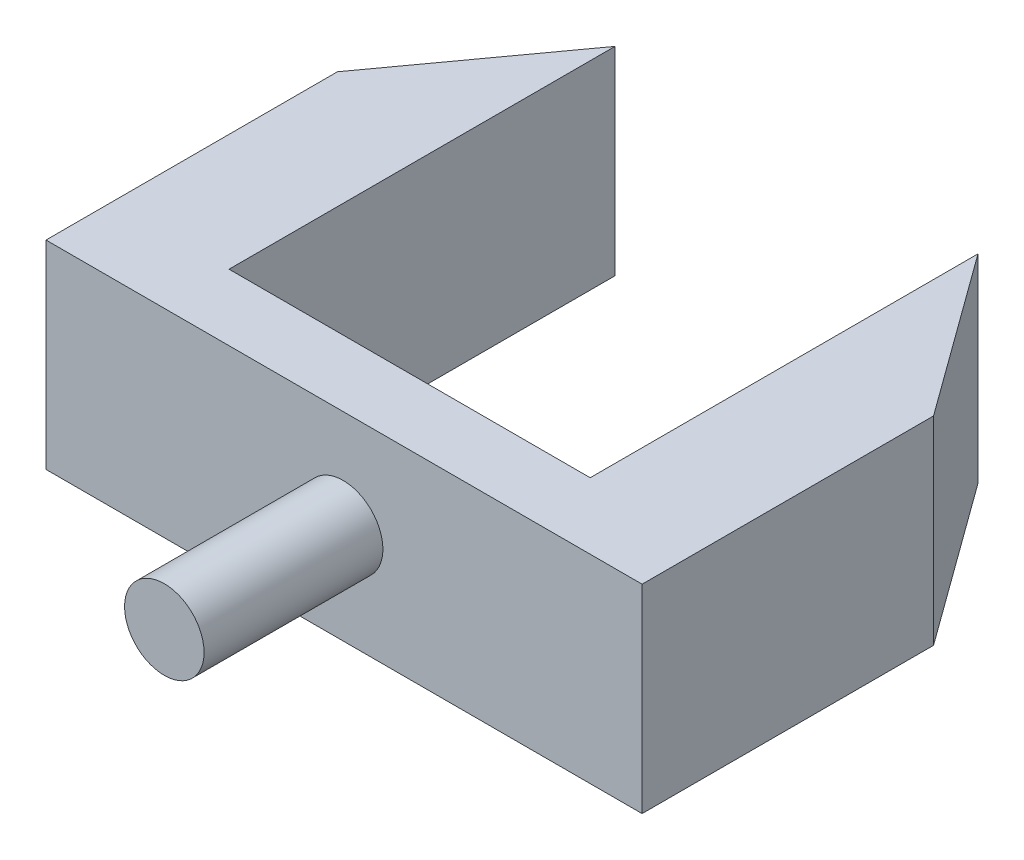
ISO-10303-21;
HEADER;
FILE_DESCRIPTION(('STEP AP214'),'2;1');
FILE_NAME('part.step','',(''),(''),'','','');
FILE_SCHEMA(('AUTOMOTIVE_DESIGN { 1 0 10303 214 1 1 1 1 }'));
ENDSEC;
DATA;
#1=APPLICATION_CONTEXT('core data for automotive mechanical design processes');
#2=APPLICATION_PROTOCOL_DEFINITION('international standard','automotive_design',2000,#1);
#3=PRODUCT_CONTEXT('',#1,'mechanical');
#4=PRODUCT('Part','Part','',(#3));
#5=PRODUCT_RELATED_PRODUCT_CATEGORY('part','',(#4));
#6=PRODUCT_DEFINITION_FORMATION('','',#4);
#7=PRODUCT_DEFINITION_CONTEXT('part definition',#1,'design');
#8=PRODUCT_DEFINITION('design','',#6,#7);
#9=PRODUCT_DEFINITION_SHAPE('','',#8);
#10=(LENGTH_UNIT() NAMED_UNIT(*) SI_UNIT(.MILLI.,.METRE.));
#11=(NAMED_UNIT(*) PLANE_ANGLE_UNIT() SI_UNIT($,.RADIAN.));
#12=(NAMED_UNIT(*) SI_UNIT($,.STERADIAN.) SOLID_ANGLE_UNIT());
#13=UNCERTAINTY_MEASURE_WITH_UNIT(LENGTH_MEASURE(1.E-05),#10,'distance_accuracy_value','');
#14=(GEOMETRIC_REPRESENTATION_CONTEXT(3) GLOBAL_UNCERTAINTY_ASSIGNED_CONTEXT((#13)) GLOBAL_UNIT_ASSIGNED_CONTEXT((#10,
#11,#12)) REPRESENTATION_CONTEXT('',''));
#15=CARTESIAN_POINT('',(0.,0.,0.));
#16=DIRECTION('',(0.,0.,1.));
#17=DIRECTION('',(1.,0.,0.));
#18=AXIS2_PLACEMENT_3D('',#15,#16,#17);
#19=CARTESIAN_POINT('',(-22.3623853211009,15.,0.));
#20=DIRECTION('',(1.,0.,0.));
#21=DIRECTION('',(0.,0.,-1.));
#22=AXIS2_PLACEMENT_3D('',#19,#20,#21);
#23=PLANE('',#22);
#24=DIRECTION('',(0.,0.,1.));
#25=VECTOR('',#24,1.);
#26=CARTESIAN_POINT('',(-22.3623853211009,0.,0.));
#27=LINE('',#26,#25);
#28=CARTESIAN_POINT('',(-22.3623853211009,0.,-22.));
#29=VERTEX_POINT('',#28);
#30=CARTESIAN_POINT('',(-22.3623853211009,0.,0.));
#31=VERTEX_POINT('',#30);
#32=EDGE_CURVE('E133',#29,#31,#27,.T.);
#33=ORIENTED_EDGE('',*,*,#32,.T.);
#34=DIRECTION('',(0.,-1.,0.));
#35=VECTOR('',#34,1.);
#36=CARTESIAN_POINT('',(-22.3623853211009,15.,0.));
#37=LINE('',#36,#35);
#38=CARTESIAN_POINT('',(-22.3623853211009,15.,0.));
#39=VERTEX_POINT('',#38);
#40=EDGE_CURVE('E44',#39,#31,#37,.T.);
#41=ORIENTED_EDGE('',*,*,#40,.F.);
#42=DIRECTION('',(0.,0.,1.));
#43=VECTOR('',#42,1.);
#44=CARTESIAN_POINT('',(-22.3623853211009,15.,0.));
#45=LINE('',#44,#43);
#46=CARTESIAN_POINT('',(-22.3623853211009,15.,-22.));
#47=VERTEX_POINT('',#46);
#48=EDGE_CURVE('E148',#47,#39,#45,.T.);
#49=ORIENTED_EDGE('',*,*,#48,.F.);
#50=DIRECTION('',(0.,-1.,0.));
#51=VECTOR('',#50,1.);
#52=CARTESIAN_POINT('',(-22.3623853211009,15.,-22.));
#53=LINE('',#52,#51);
#54=EDGE_CURVE('E129',#47,#29,#53,.T.);
#55=ORIENTED_EDGE('',*,*,#54,.T.);
#56=EDGE_LOOP('',(#33,#41,#49,#55));
#57=FACE_BOUND('',#56,.T.);
#58=ADVANCED_FACE('F36',(#57),#23,.F.);
#59=CARTESIAN_POINT('',(-22.3623853211009,15.,0.));
#60=DIRECTION('',(0.,0.,-1.));
#61=DIRECTION('',(-1.,0.,0.));
#62=AXIS2_PLACEMENT_3D('',#59,#60,#61);
#63=PLANE('',#62);
#64=CARTESIAN_POINT('',(0.068807339449542,7.5,0.));
#65=DIRECTION('',(0.,0.,-1.));
#66=DIRECTION('',(-1.,0.,0.));
#67=AXIS2_PLACEMENT_3D('',#64,#65,#66);
#68=CIRCLE('',#67,3.);
#69=CARTESIAN_POINT('',(-2.93119266055046,7.5,0.));
#70=VERTEX_POINT('',#69);
#71=EDGE_CURVE('E11',#70,#70,#68,.F.);
#72=ORIENTED_EDGE('',*,*,#71,.F.);
#73=EDGE_LOOP('',(#72));
#74=FACE_BOUND('',#73,.T.);
#75=DIRECTION('',(1.,0.,0.));
#76=VECTOR('',#75,1.);
#77=CARTESIAN_POINT('',(-22.3623853211009,0.,0.));
#78=LINE('',#77,#76);
#79=CARTESIAN_POINT('',(22.6376146788991,0.,0.));
#80=VERTEX_POINT('',#79);
#81=EDGE_CURVE('E136',#31,#80,#78,.T.);
#82=ORIENTED_EDGE('',*,*,#81,.T.);
#83=DIRECTION('',(0.,-1.,0.));
#84=VECTOR('',#83,1.);
#85=CARTESIAN_POINT('',(22.6376146788991,15.,0.));
#86=LINE('',#85,#84);
#87=CARTESIAN_POINT('',(22.6376146788991,15.,0.));
#88=VERTEX_POINT('',#87);
#89=EDGE_CURVE('E158',#88,#80,#86,.T.);
#90=ORIENTED_EDGE('',*,*,#89,.F.);
#91=DIRECTION('',(1.,0.,0.));
#92=VECTOR('',#91,1.);
#93=CARTESIAN_POINT('',(-22.3623853211009,15.,0.));
#94=LINE('',#93,#92);
#95=EDGE_CURVE('E96',#39,#88,#94,.T.);
#96=ORIENTED_EDGE('',*,*,#95,.F.);
#97=ORIENTED_EDGE('',*,*,#40,.T.);
#98=EDGE_LOOP('',(#82,#90,#96,#97));
#99=FACE_BOUND('',#98,.T.);
#100=ADVANCED_FACE('F161',(#74,#99),#63,.F.);
#101=CARTESIAN_POINT('',(22.6376146788991,15.,0.));
#102=DIRECTION('',(-1.,0.,0.));
#103=DIRECTION('',(0.,0.,1.));
#104=AXIS2_PLACEMENT_3D('',#101,#102,#103);
#105=PLANE('',#104);
#106=DIRECTION('',(0.,0.,-1.));
#107=VECTOR('',#106,1.);
#108=CARTESIAN_POINT('',(22.6376146788991,0.,0.));
#109=LINE('',#108,#107);
#110=CARTESIAN_POINT('',(22.6376146788991,0.,-22.));
#111=VERTEX_POINT('',#110);
#112=EDGE_CURVE('E139',#80,#111,#109,.T.);
#113=ORIENTED_EDGE('',*,*,#112,.T.);
#114=DIRECTION('',(0.,-1.,0.));
#115=VECTOR('',#114,1.);
#116=CARTESIAN_POINT('',(22.6376146788991,15.,-22.));
#117=LINE('',#116,#115);
#118=CARTESIAN_POINT('',(22.6376146788991,15.,-22.));
#119=VERTEX_POINT('',#118);
#120=EDGE_CURVE('E155',#119,#111,#117,.T.);
#121=ORIENTED_EDGE('',*,*,#120,.F.);
#122=DIRECTION('',(0.,0.,-1.));
#123=VECTOR('',#122,1.);
#124=CARTESIAN_POINT('',(22.6376146788991,15.,0.));
#125=LINE('',#124,#123);
#126=EDGE_CURVE('E179',#88,#119,#125,.T.);
#127=ORIENTED_EDGE('',*,*,#126,.F.);
#128=ORIENTED_EDGE('',*,*,#89,.T.);
#129=EDGE_LOOP('',(#113,#121,#127,#128));
#130=FACE_BOUND('',#129,.T.);
#131=ADVANCED_FACE('F172',(#130),#105,.F.);
#132=CARTESIAN_POINT('',(22.6376146788991,15.,-22.));
#133=DIRECTION('',(-0.809016994374947,0.,0.587785252292474));
#134=DIRECTION('',(0.587785252292474,0.,0.809016994374947));
#135=AXIS2_PLACEMENT_3D('',#132,#133,#134);
#136=PLANE('',#135);
#137=DIRECTION('',(-0.587785252292474,0.,-0.809016994374947));
#138=VECTOR('',#137,1.);
#139=CARTESIAN_POINT('',(22.6376146788991,0.,-22.));
#140=LINE('',#139,#138);
#141=CARTESIAN_POINT('',(13.7189171020698,0.,-34.2755340988979));
#142=VERTEX_POINT('',#141);
#143=EDGE_CURVE('E141',#111,#142,#140,.T.);
#144=ORIENTED_EDGE('',*,*,#143,.T.);
#145=DIRECTION('',(0.,-1.,0.));
#146=VECTOR('',#145,1.);
#147=CARTESIAN_POINT('',(13.7189171020698,15.,-34.2755340988979));
#148=LINE('',#147,#146);
#149=CARTESIAN_POINT('',(13.7189171020698,15.,-34.2755340988979));
#150=VERTEX_POINT('',#149);
#151=EDGE_CURVE('E152',#150,#142,#148,.T.);
#152=ORIENTED_EDGE('',*,*,#151,.F.);
#153=DIRECTION('',(-0.587785252292474,0.,-0.809016994374947));
#154=VECTOR('',#153,1.);
#155=CARTESIAN_POINT('',(22.6376146788991,15.,-22.));
#156=LINE('',#155,#154);
#157=EDGE_CURVE('E178',#119,#150,#156,.T.);
#158=ORIENTED_EDGE('',*,*,#157,.F.);
#159=ORIENTED_EDGE('',*,*,#120,.T.);
#160=EDGE_LOOP('',(#144,#152,#158,#159));
#161=FACE_BOUND('',#160,.T.);
#162=ADVANCED_FACE('F176',(#161),#136,.F.);
#163=CARTESIAN_POINT('',(13.7189171020698,15.,-5.));
#164=DIRECTION('',(1.,0.,0.));
#165=DIRECTION('',(0.,0.,-1.));
#166=AXIS2_PLACEMENT_3D('',#163,#164,#165);
#167=PLANE('',#166);
#168=DIRECTION('',(0.,0.,1.));
#169=VECTOR('',#168,1.);
#170=CARTESIAN_POINT('',(13.7189171020698,0.,-5.));
#171=LINE('',#170,#169);
#172=CARTESIAN_POINT('',(13.7189171020698,0.,-5.));
#173=VERTEX_POINT('',#172);
#174=EDGE_CURVE('E143',#142,#173,#171,.T.);
#175=ORIENTED_EDGE('',*,*,#174,.T.);
#176=DIRECTION('',(0.,-1.,0.));
#177=VECTOR('',#176,1.);
#178=CARTESIAN_POINT('',(13.7189171020698,15.,-5.));
#179=LINE('',#178,#177);
#180=CARTESIAN_POINT('',(13.7189171020698,15.,-5.));
#181=VERTEX_POINT('',#180);
#182=EDGE_CURVE('E124',#181,#173,#179,.T.);
#183=ORIENTED_EDGE('',*,*,#182,.F.);
#184=DIRECTION('',(0.,0.,1.));
#185=VECTOR('',#184,1.);
#186=CARTESIAN_POINT('',(13.7189171020698,15.,-5.));
#187=LINE('',#186,#185);
#188=EDGE_CURVE('E115',#150,#181,#187,.T.);
#189=ORIENTED_EDGE('',*,*,#188,.F.);
#190=ORIENTED_EDGE('',*,*,#151,.T.);
#191=EDGE_LOOP('',(#175,#183,#189,#190));
#192=FACE_BOUND('',#191,.T.);
#193=ADVANCED_FACE('F205',(#192),#167,.F.);
#194=CARTESIAN_POINT('',(-13.5456065367138,15.,-5.));
#195=DIRECTION('',(0.,0.,1.));
#196=DIRECTION('',(1.,0.,0.));
#197=AXIS2_PLACEMENT_3D('',#194,#195,#196);
#198=PLANE('',#197);
#199=DIRECTION('',(-1.,0.,0.));
#200=VECTOR('',#199,1.);
#201=CARTESIAN_POINT('',(-13.5456065367138,0.,-5.));
#202=LINE('',#201,#200);
#203=CARTESIAN_POINT('',(-13.5456065367138,0.,-5.));
#204=VERTEX_POINT('',#203);
#205=EDGE_CURVE('E123',#173,#204,#202,.T.);
#206=ORIENTED_EDGE('',*,*,#205,.T.);
#207=DIRECTION('',(0.,-1.,0.));
#208=VECTOR('',#207,1.);
#209=CARTESIAN_POINT('',(-13.5456065367138,15.,-5.));
#210=LINE('',#209,#208);
#211=CARTESIAN_POINT('',(-13.5456065367138,15.,-5.));
#212=VERTEX_POINT('',#211);
#213=EDGE_CURVE('E120',#212,#204,#210,.T.);
#214=ORIENTED_EDGE('',*,*,#213,.F.);
#215=DIRECTION('',(-1.,0.,0.));
#216=VECTOR('',#215,1.);
#217=CARTESIAN_POINT('',(-13.5456065367138,15.,-5.));
#218=LINE('',#217,#216);
#219=EDGE_CURVE('E109',#181,#212,#218,.T.);
#220=ORIENTED_EDGE('',*,*,#219,.F.);
#221=ORIENTED_EDGE('',*,*,#182,.T.);
#222=EDGE_LOOP('',(#206,#214,#220,#221));
#223=FACE_BOUND('',#222,.T.);
#224=ADVANCED_FACE('F121',(#223),#198,.F.);
#225=CARTESIAN_POINT('',(-13.5456065367138,15.,-34.1352549156242));
#226=DIRECTION('',(-1.,0.,0.));
#227=DIRECTION('',(0.,0.,1.));
#228=AXIS2_PLACEMENT_3D('',#225,#226,#227);
#229=PLANE('',#228);
#230=DIRECTION('',(0.,0.,-1.));
#231=VECTOR('',#230,1.);
#232=CARTESIAN_POINT('',(-13.5456065367138,0.,-34.1352549156242));
#233=LINE('',#232,#231);
#234=CARTESIAN_POINT('',(-13.5456065367138,0.,-34.1352549156242));
#235=VERTEX_POINT('',#234);
#236=EDGE_CURVE('E81',#204,#235,#233,.T.);
#237=ORIENTED_EDGE('',*,*,#236,.T.);
#238=DIRECTION('',(0.,-1.,0.));
#239=VECTOR('',#238,1.);
#240=CARTESIAN_POINT('',(-13.5456065367138,15.,-34.1352549156242));
#241=LINE('',#240,#239);
#242=CARTESIAN_POINT('',(-13.5456065367138,15.,-34.1352549156242));
#243=VERTEX_POINT('',#242);
#244=EDGE_CURVE('E125',#243,#235,#241,.T.);
#245=ORIENTED_EDGE('',*,*,#244,.F.);
#246=DIRECTION('',(0.,0.,-1.));
#247=VECTOR('',#246,1.);
#248=CARTESIAN_POINT('',(-13.5456065367138,15.,-34.1352549156242));
#249=LINE('',#248,#247);
#250=EDGE_CURVE('E113',#212,#243,#249,.T.);
#251=ORIENTED_EDGE('',*,*,#250,.F.);
#252=ORIENTED_EDGE('',*,*,#213,.T.);
#253=EDGE_LOOP('',(#237,#245,#251,#252));
#254=FACE_BOUND('',#253,.T.);
#255=ADVANCED_FACE('F127',(#254),#229,.F.);
#256=CARTESIAN_POINT('',(-22.3623853211009,15.,-22.));
#257=DIRECTION('',(0.809016994374947,0.,0.587785252292474));
#258=DIRECTION('',(0.587785252292474,0.,-0.809016994374947));
#259=AXIS2_PLACEMENT_3D('',#256,#257,#258);
#260=PLANE('',#259);
#261=DIRECTION('',(-0.587785252292474,0.,0.809016994374947));
#262=VECTOR('',#261,1.);
#263=CARTESIAN_POINT('',(-22.3623853211009,0.,-22.));
#264=LINE('',#263,#262);
#265=EDGE_CURVE('E87',#235,#29,#264,.T.);
#266=ORIENTED_EDGE('',*,*,#265,.T.);
#267=ORIENTED_EDGE('',*,*,#54,.F.);
#268=DIRECTION('',(-0.587785252292474,0.,0.809016994374947));
#269=VECTOR('',#268,1.);
#270=CARTESIAN_POINT('',(-22.3623853211009,15.,-22.));
#271=LINE('',#270,#269);
#272=EDGE_CURVE('E52',#243,#47,#271,.T.);
#273=ORIENTED_EDGE('',*,*,#272,.F.);
#274=ORIENTED_EDGE('',*,*,#244,.T.);
#275=EDGE_LOOP('',(#266,#267,#273,#274));
#276=FACE_BOUND('',#275,.T.);
#277=ADVANCED_FACE('F213',(#276),#260,.F.);
#278=CARTESIAN_POINT('',(0.,15.,0.));
#279=DIRECTION('',(0.,-1.,0.));
#280=DIRECTION('',(0.,0.,-1.));
#281=AXIS2_PLACEMENT_3D('',#278,#279,#280);
#282=PLANE('',#281);
#283=ORIENTED_EDGE('',*,*,#48,.T.);
#284=ORIENTED_EDGE('',*,*,#95,.T.);
#285=ORIENTED_EDGE('',*,*,#126,.T.);
#286=ORIENTED_EDGE('',*,*,#157,.T.);
#287=ORIENTED_EDGE('',*,*,#188,.T.);
#288=ORIENTED_EDGE('',*,*,#219,.T.);
#289=ORIENTED_EDGE('',*,*,#250,.T.);
#290=ORIENTED_EDGE('',*,*,#272,.T.);
#291=EDGE_LOOP('',(#283,#284,#285,#286,#287,#288,#289,#290));
#292=FACE_BOUND('',#291,.T.);
#293=ADVANCED_FACE('F111',(#292),#282,.F.);
#294=CARTESIAN_POINT('',(0.,0.,0.));
#295=DIRECTION('',(0.,-1.,0.));
#296=DIRECTION('',(0.,0.,-1.));
#297=AXIS2_PLACEMENT_3D('',#294,#295,#296);
#298=PLANE('',#297);
#299=ORIENTED_EDGE('',*,*,#32,.F.);
#300=ORIENTED_EDGE('',*,*,#265,.F.);
#301=ORIENTED_EDGE('',*,*,#236,.F.);
#302=ORIENTED_EDGE('',*,*,#205,.F.);
#303=ORIENTED_EDGE('',*,*,#174,.F.);
#304=ORIENTED_EDGE('',*,*,#143,.F.);
#305=ORIENTED_EDGE('',*,*,#112,.F.);
#306=ORIENTED_EDGE('',*,*,#81,.F.);
#307=EDGE_LOOP('',(#299,#300,#301,#302,#303,#304,#305,#306));
#308=FACE_BOUND('',#307,.T.);
#309=ADVANCED_FACE('F166',(#308),#298,.T.);
#310=CARTESIAN_POINT('',(0.068807339449542,7.5,13.5));
#311=DIRECTION('',(0.,0.,-1.));
#312=DIRECTION('',(-1.,0.,0.));
#313=AXIS2_PLACEMENT_3D('',#310,#311,#312);
#314=CYLINDRICAL_SURFACE('',#313,3.);
#315=CARTESIAN_POINT('',(0.068807339449542,7.5,13.5));
#316=DIRECTION('',(0.,0.,1.));
#317=DIRECTION('',(1.,0.,0.));
#318=AXIS2_PLACEMENT_3D('',#315,#316,#317);
#319=CIRCLE('',#318,3.);
#320=CARTESIAN_POINT('',(3.06880733944954,7.5,13.5));
#321=VERTEX_POINT('',#320);
#322=EDGE_CURVE('E137',#321,#321,#319,.T.);
#323=ORIENTED_EDGE('',*,*,#322,.F.);
#324=EDGE_LOOP('',(#323));
#325=FACE_BOUND('',#324,.T.);
#326=ORIENTED_EDGE('',*,*,#71,.T.);
#327=EDGE_LOOP('',(#326));
#328=FACE_BOUND('',#327,.T.);
#329=ADVANCED_FACE('F190',(#325,#328),#314,.T.);
#330=CARTESIAN_POINT('',(0.068807339449542,7.5,13.5));
#331=DIRECTION('',(0.,0.,1.));
#332=DIRECTION('',(1.,0.,0.));
#333=AXIS2_PLACEMENT_3D('',#330,#331,#332);
#334=PLANE('',#333);
#335=ORIENTED_EDGE('',*,*,#322,.T.);
#336=EDGE_LOOP('',(#335));
#337=FACE_BOUND('',#336,.T.);
#338=ADVANCED_FACE('F188',(#337),#334,.T.);
#339=CLOSED_SHELL('',(#58,#100,#131,#162,#193,#224,#255,#277,#293,#309,#329,#338));
#340=MANIFOLD_SOLID_BREP('B2',#339);
#341=ADVANCED_BREP_SHAPE_REPRESENTATION('',(#18,#340),#14);
#342=SHAPE_DEFINITION_REPRESENTATION(#9,#341);
ENDSEC;
END-ISO-10303-21;
